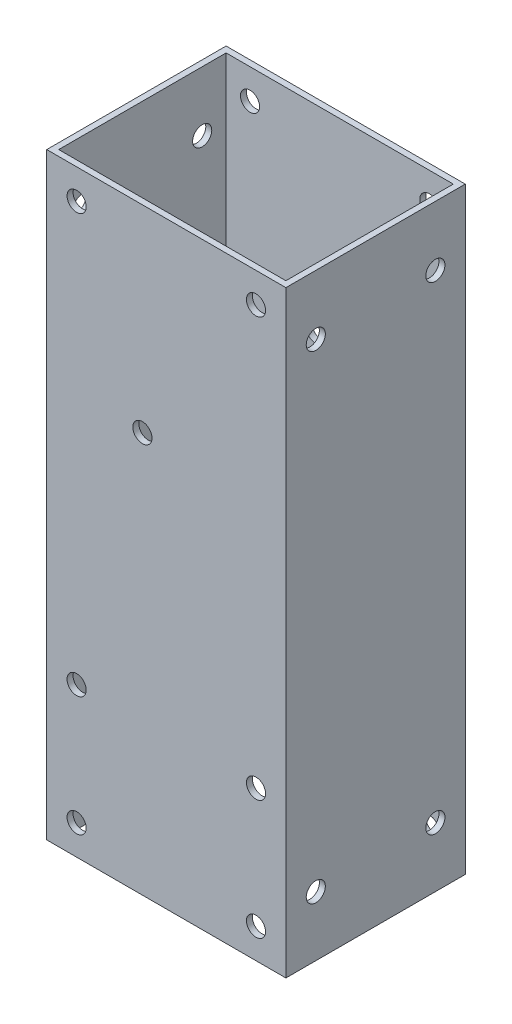
ISO-10303-21;
HEADER;
FILE_DESCRIPTION(('STEP AP214'),'2;1');
FILE_NAME('part.step','',(''),(''),'','','');
FILE_SCHEMA(('AUTOMOTIVE_DESIGN { 1 0 10303 214 1 1 1 1 }'));
ENDSEC;
DATA;
#1=APPLICATION_CONTEXT('core data for automotive mechanical design processes');
#2=APPLICATION_PROTOCOL_DEFINITION('international standard','automotive_design',2000,#1);
#3=PRODUCT_CONTEXT('',#1,'mechanical');
#4=PRODUCT('Part','Part','',(#3));
#5=PRODUCT_RELATED_PRODUCT_CATEGORY('part','',(#4));
#6=PRODUCT_DEFINITION_FORMATION('','',#4);
#7=PRODUCT_DEFINITION_CONTEXT('part definition',#1,'design');
#8=PRODUCT_DEFINITION('design','',#6,#7);
#9=PRODUCT_DEFINITION_SHAPE('','',#8);
#10=(LENGTH_UNIT() NAMED_UNIT(*) SI_UNIT(.MILLI.,.METRE.));
#11=(NAMED_UNIT(*) PLANE_ANGLE_UNIT() SI_UNIT($,.RADIAN.));
#12=(NAMED_UNIT(*) SI_UNIT($,.STERADIAN.) SOLID_ANGLE_UNIT());
#13=UNCERTAINTY_MEASURE_WITH_UNIT(LENGTH_MEASURE(1.E-05),#10,'distance_accuracy_value','');
#14=(GEOMETRIC_REPRESENTATION_CONTEXT(3) GLOBAL_UNCERTAINTY_ASSIGNED_CONTEXT((#13)) GLOBAL_UNIT_ASSIGNED_CONTEXT((#10,
#11,#12)) REPRESENTATION_CONTEXT('',''));
#15=CARTESIAN_POINT('',(0.,0.,0.));
#16=DIRECTION('',(0.,0.,1.));
#17=DIRECTION('',(1.,0.,0.));
#18=AXIS2_PLACEMENT_3D('',#15,#16,#17);
#19=CARTESIAN_POINT('',(0.,100.,0.));
#20=DIRECTION('',(0.,1.,0.));
#21=DIRECTION('',(0.,0.,1.));
#22=AXIS2_PLACEMENT_3D('',#19,#20,#21);
#23=PLANE('',#22);
#24=DIRECTION('',(0.,0.,1.));
#25=VECTOR('',#24,1.);
#26=CARTESIAN_POINT('',(0.,100.,0.));
#27=LINE('',#26,#25);
#28=CARTESIAN_POINT('',(0.,100.,-30.));
#29=VERTEX_POINT('',#28);
#30=CARTESIAN_POINT('',(0.,100.,0.));
#31=VERTEX_POINT('',#30);
#32=EDGE_CURVE('E174',#29,#31,#27,.T.);
#33=ORIENTED_EDGE('',*,*,#32,.T.);
#34=DIRECTION('',(1.,0.,0.));
#35=VECTOR('',#34,1.);
#36=CARTESIAN_POINT('',(0.,100.,0.));
#37=LINE('',#36,#35);
#38=CARTESIAN_POINT('',(40.,100.,0.));
#39=VERTEX_POINT('',#38);
#40=EDGE_CURVE('E177',#31,#39,#37,.T.);
#41=ORIENTED_EDGE('',*,*,#40,.T.);
#42=DIRECTION('',(0.,0.,-1.));
#43=VECTOR('',#42,1.);
#44=CARTESIAN_POINT('',(40.,100.,0.));
#45=LINE('',#44,#43);
#46=CARTESIAN_POINT('',(40.,100.,-30.));
#47=VERTEX_POINT('',#46);
#48=EDGE_CURVE('E180',#39,#47,#45,.T.);
#49=ORIENTED_EDGE('',*,*,#48,.T.);
#50=DIRECTION('',(-1.,0.,0.));
#51=VECTOR('',#50,1.);
#52=CARTESIAN_POINT('',(0.,100.,-30.));
#53=LINE('',#52,#51);
#54=EDGE_CURVE('E182',#47,#29,#53,.T.);
#55=ORIENTED_EDGE('',*,*,#54,.T.);
#56=EDGE_LOOP('',(#33,#41,#49,#55));
#57=FACE_BOUND('',#56,.T.);
#58=DIRECTION('',(1.,0.,0.));
#59=VECTOR('',#58,1.);
#60=CARTESIAN_POINT('',(0.,100.,-1.));
#61=LINE('',#60,#59);
#62=CARTESIAN_POINT('',(1.,100.,-1.));
#63=VERTEX_POINT('',#62);
#64=CARTESIAN_POINT('',(39.,100.,-1.));
#65=VERTEX_POINT('',#64);
#66=EDGE_CURVE('E144',#63,#65,#61,.T.);
#67=ORIENTED_EDGE('',*,*,#66,.F.);
#68=DIRECTION('',(0.,0.,1.));
#69=VECTOR('',#68,1.);
#70=CARTESIAN_POINT('',(1.,100.,0.));
#71=LINE('',#70,#69);
#72=CARTESIAN_POINT('',(1.,100.,-29.));
#73=VERTEX_POINT('',#72);
#74=EDGE_CURVE('E136',#73,#63,#71,.T.);
#75=ORIENTED_EDGE('',*,*,#74,.F.);
#76=DIRECTION('',(-1.,0.,0.));
#77=VECTOR('',#76,1.);
#78=CARTESIAN_POINT('',(0.,100.,-29.));
#79=LINE('',#78,#77);
#80=CARTESIAN_POINT('',(39.,100.,-29.));
#81=VERTEX_POINT('',#80);
#82=EDGE_CURVE('E158',#81,#73,#79,.T.);
#83=ORIENTED_EDGE('',*,*,#82,.F.);
#84=DIRECTION('',(0.,0.,-1.));
#85=VECTOR('',#84,1.);
#86=CARTESIAN_POINT('',(39.,100.,0.));
#87=LINE('',#86,#85);
#88=EDGE_CURVE('E156',#65,#81,#87,.T.);
#89=ORIENTED_EDGE('',*,*,#88,.F.);
#90=EDGE_LOOP('',(#67,#75,#83,#89));
#91=FACE_BOUND('',#90,.T.);
#92=ADVANCED_FACE('F69',(#57,#91),#23,.T.);
#93=CARTESIAN_POINT('',(0.,0.,0.));
#94=DIRECTION('',(0.,1.,0.));
#95=DIRECTION('',(0.,0.,1.));
#96=AXIS2_PLACEMENT_3D('',#93,#94,#95);
#97=PLANE('',#96);
#98=DIRECTION('',(0.,0.,1.));
#99=VECTOR('',#98,1.);
#100=CARTESIAN_POINT('',(0.,0.,0.));
#101=LINE('',#100,#99);
#102=CARTESIAN_POINT('',(0.,0.,-30.));
#103=VERTEX_POINT('',#102);
#104=CARTESIAN_POINT('',(0.,0.,0.));
#105=VERTEX_POINT('',#104);
#106=EDGE_CURVE('E152',#103,#105,#101,.T.);
#107=ORIENTED_EDGE('',*,*,#106,.F.);
#108=DIRECTION('',(-1.,0.,0.));
#109=VECTOR('',#108,1.);
#110=CARTESIAN_POINT('',(0.,0.,-30.));
#111=LINE('',#110,#109);
#112=CARTESIAN_POINT('',(40.,0.,-30.));
#113=VERTEX_POINT('',#112);
#114=EDGE_CURVE('E178',#113,#103,#111,.T.);
#115=ORIENTED_EDGE('',*,*,#114,.F.);
#116=DIRECTION('',(0.,0.,-1.));
#117=VECTOR('',#116,1.);
#118=CARTESIAN_POINT('',(40.,0.,0.));
#119=LINE('',#118,#117);
#120=CARTESIAN_POINT('',(40.,0.,0.));
#121=VERTEX_POINT('',#120);
#122=EDGE_CURVE('E189',#121,#113,#119,.T.);
#123=ORIENTED_EDGE('',*,*,#122,.F.);
#124=DIRECTION('',(1.,0.,0.));
#125=VECTOR('',#124,1.);
#126=CARTESIAN_POINT('',(0.,0.,0.));
#127=LINE('',#126,#125);
#128=EDGE_CURVE('E187',#105,#121,#127,.T.);
#129=ORIENTED_EDGE('',*,*,#128,.F.);
#130=EDGE_LOOP('',(#107,#115,#123,#129));
#131=FACE_BOUND('',#130,.T.);
#132=DIRECTION('',(0.,0.,1.));
#133=VECTOR('',#132,1.);
#134=CARTESIAN_POINT('',(1.,0.,0.));
#135=LINE('',#134,#133);
#136=CARTESIAN_POINT('',(1.,0.,-29.));
#137=VERTEX_POINT('',#136);
#138=CARTESIAN_POINT('',(1.,0.,-1.));
#139=VERTEX_POINT('',#138);
#140=EDGE_CURVE('E94',#137,#139,#135,.T.);
#141=ORIENTED_EDGE('',*,*,#140,.T.);
#142=DIRECTION('',(1.,0.,0.));
#143=VECTOR('',#142,1.);
#144=CARTESIAN_POINT('',(0.,0.,-1.));
#145=LINE('',#144,#143);
#146=CARTESIAN_POINT('',(39.,0.,-1.));
#147=VERTEX_POINT('',#146);
#148=EDGE_CURVE('E151',#139,#147,#145,.T.);
#149=ORIENTED_EDGE('',*,*,#148,.T.);
#150=DIRECTION('',(0.,0.,-1.));
#151=VECTOR('',#150,1.);
#152=CARTESIAN_POINT('',(39.,0.,0.));
#153=LINE('',#152,#151);
#154=CARTESIAN_POINT('',(39.,0.,-29.));
#155=VERTEX_POINT('',#154);
#156=EDGE_CURVE('E166',#147,#155,#153,.T.);
#157=ORIENTED_EDGE('',*,*,#156,.T.);
#158=DIRECTION('',(-1.,0.,0.));
#159=VECTOR('',#158,1.);
#160=CARTESIAN_POINT('',(0.,0.,-29.));
#161=LINE('',#160,#159);
#162=EDGE_CURVE('E145',#155,#137,#161,.T.);
#163=ORIENTED_EDGE('',*,*,#162,.T.);
#164=EDGE_LOOP('',(#141,#149,#157,#163));
#165=FACE_BOUND('',#164,.T.);
#166=ADVANCED_FACE('F337',(#131,#165),#97,.F.);
#167=CARTESIAN_POINT('',(0.,100.,0.));
#168=DIRECTION('',(1.,0.,0.));
#169=DIRECTION('',(0.,0.,-1.));
#170=AXIS2_PLACEMENT_3D('',#167,#168,#169);
#171=PLANE('',#170);
#172=CARTESIAN_POINT('',(0.,90.,-5.));
#173=DIRECTION('',(-1.,0.,0.));
#174=DIRECTION('',(0.,0.,1.));
#175=AXIS2_PLACEMENT_3D('',#172,#173,#174);
#176=CIRCLE('',#175,1.6);
#177=CARTESIAN_POINT('',(0.,90.,-3.4));
#178=VERTEX_POINT('',#177);
#179=EDGE_CURVE('E418',#178,#178,#176,.T.);
#180=ORIENTED_EDGE('',*,*,#179,.F.);
#181=EDGE_LOOP('',(#180));
#182=FACE_BOUND('',#181,.T.);
#183=CARTESIAN_POINT('',(0.,10.,-25.));
#184=DIRECTION('',(-1.,0.,0.));
#185=DIRECTION('',(0.,0.,1.));
#186=AXIS2_PLACEMENT_3D('',#183,#184,#185);
#187=CIRCLE('',#186,1.6);
#188=CARTESIAN_POINT('',(0.,10.,-23.4));
#189=VERTEX_POINT('',#188);
#190=EDGE_CURVE('E383',#189,#189,#187,.T.);
#191=ORIENTED_EDGE('',*,*,#190,.F.);
#192=EDGE_LOOP('',(#191));
#193=FACE_BOUND('',#192,.T.);
#194=CARTESIAN_POINT('',(0.,10.,-4.99999999999999));
#195=DIRECTION('',(-1.,0.,0.));
#196=DIRECTION('',(0.,0.,1.));
#197=AXIS2_PLACEMENT_3D('',#194,#195,#196);
#198=CIRCLE('',#197,1.6);
#199=CARTESIAN_POINT('',(0.,10.,-3.39999999999999));
#200=VERTEX_POINT('',#199);
#201=EDGE_CURVE('E409',#200,#200,#198,.T.);
#202=ORIENTED_EDGE('',*,*,#201,.F.);
#203=EDGE_LOOP('',(#202));
#204=FACE_BOUND('',#203,.T.);
#205=CARTESIAN_POINT('',(0.,90.,-25.));
#206=DIRECTION('',(-1.,0.,0.));
#207=DIRECTION('',(0.,0.,1.));
#208=AXIS2_PLACEMENT_3D('',#205,#206,#207);
#209=CIRCLE('',#208,1.6);
#210=CARTESIAN_POINT('',(0.,90.,-23.4));
#211=VERTEX_POINT('',#210);
#212=EDGE_CURVE('E378',#211,#211,#209,.T.);
#213=ORIENTED_EDGE('',*,*,#212,.F.);
#214=EDGE_LOOP('',(#213));
#215=FACE_BOUND('',#214,.T.);
#216=ORIENTED_EDGE('',*,*,#106,.T.);
#217=DIRECTION('',(0.,-1.,0.));
#218=VECTOR('',#217,1.);
#219=CARTESIAN_POINT('',(0.,100.,0.));
#220=LINE('',#219,#218);
#221=EDGE_CURVE('E12',#31,#105,#220,.T.);
#222=ORIENTED_EDGE('',*,*,#221,.F.);
#223=ORIENTED_EDGE('',*,*,#32,.F.);
#224=DIRECTION('',(0.,-1.,0.));
#225=VECTOR('',#224,1.);
#226=CARTESIAN_POINT('',(0.,100.,-30.));
#227=LINE('',#226,#225);
#228=EDGE_CURVE('E184',#29,#103,#227,.T.);
#229=ORIENTED_EDGE('',*,*,#228,.T.);
#230=EDGE_LOOP('',(#216,#222,#223,#229));
#231=FACE_BOUND('',#230,.T.);
#232=ADVANCED_FACE('F71',(#182,#193,#204,#215,#231),#171,.F.);
#233=CARTESIAN_POINT('',(0.,100.,0.));
#234=DIRECTION('',(0.,0.,-1.));
#235=DIRECTION('',(-1.,0.,0.));
#236=AXIS2_PLACEMENT_3D('',#233,#234,#235);
#237=PLANE('',#236);
#238=CARTESIAN_POINT('',(16.,67.,0.));
#239=DIRECTION('',(0.,0.,1.));
#240=DIRECTION('',(1.,0.,0.));
#241=AXIS2_PLACEMENT_3D('',#238,#239,#240);
#242=CIRCLE('',#241,1.60000000000001);
#243=CARTESIAN_POINT('',(17.6,67.,0.));
#244=VERTEX_POINT('',#243);
#245=EDGE_CURVE('E630',#244,#244,#242,.T.);
#246=ORIENTED_EDGE('',*,*,#245,.F.);
#247=EDGE_LOOP('',(#246));
#248=FACE_BOUND('',#247,.T.);
#249=CARTESIAN_POINT('',(35.,95.,0.));
#250=DIRECTION('',(0.,0.,1.));
#251=DIRECTION('',(1.,0.,0.));
#252=AXIS2_PLACEMENT_3D('',#249,#250,#251);
#253=CIRCLE('',#252,1.6);
#254=CARTESIAN_POINT('',(36.6,95.,0.));
#255=VERTEX_POINT('',#254);
#256=EDGE_CURVE('E260',#255,#255,#253,.T.);
#257=ORIENTED_EDGE('',*,*,#256,.F.);
#258=EDGE_LOOP('',(#257));
#259=FACE_BOUND('',#258,.T.);
#260=CARTESIAN_POINT('',(35.,25.,0.));
#261=DIRECTION('',(0.,0.,1.));
#262=DIRECTION('',(1.,0.,0.));
#263=AXIS2_PLACEMENT_3D('',#260,#261,#262);
#264=CIRCLE('',#263,1.6);
#265=CARTESIAN_POINT('',(36.6,25.,0.));
#266=VERTEX_POINT('',#265);
#267=EDGE_CURVE('E266',#266,#266,#264,.T.);
#268=ORIENTED_EDGE('',*,*,#267,.F.);
#269=EDGE_LOOP('',(#268));
#270=FACE_BOUND('',#269,.T.);
#271=CARTESIAN_POINT('',(5.00000000000001,25.,0.));
#272=DIRECTION('',(0.,0.,1.));
#273=DIRECTION('',(1.,0.,0.));
#274=AXIS2_PLACEMENT_3D('',#271,#272,#273);
#275=CIRCLE('',#274,1.6);
#276=CARTESIAN_POINT('',(6.60000000000001,25.,0.));
#277=VERTEX_POINT('',#276);
#278=EDGE_CURVE('E272',#277,#277,#275,.T.);
#279=ORIENTED_EDGE('',*,*,#278,.F.);
#280=EDGE_LOOP('',(#279));
#281=FACE_BOUND('',#280,.T.);
#282=CARTESIAN_POINT('',(5.00000000000001,5.,0.));
#283=DIRECTION('',(0.,0.,1.));
#284=DIRECTION('',(1.,0.,0.));
#285=AXIS2_PLACEMENT_3D('',#282,#283,#284);
#286=CIRCLE('',#285,1.6);
#287=CARTESIAN_POINT('',(6.60000000000001,5.,0.));
#288=VERTEX_POINT('',#287);
#289=EDGE_CURVE('E253',#288,#288,#286,.T.);
#290=ORIENTED_EDGE('',*,*,#289,.F.);
#291=EDGE_LOOP('',(#290));
#292=FACE_BOUND('',#291,.T.);
#293=CARTESIAN_POINT('',(35.,5.,0.));
#294=DIRECTION('',(0.,0.,1.));
#295=DIRECTION('',(1.,0.,0.));
#296=AXIS2_PLACEMENT_3D('',#293,#294,#295);
#297=CIRCLE('',#296,1.6);
#298=CARTESIAN_POINT('',(36.6,5.,0.));
#299=VERTEX_POINT('',#298);
#300=EDGE_CURVE('E241',#299,#299,#297,.T.);
#301=ORIENTED_EDGE('',*,*,#300,.F.);
#302=EDGE_LOOP('',(#301));
#303=FACE_BOUND('',#302,.T.);
#304=CARTESIAN_POINT('',(5.,95.,0.));
#305=DIRECTION('',(0.,0.,1.));
#306=DIRECTION('',(1.,0.,0.));
#307=AXIS2_PLACEMENT_3D('',#304,#305,#306);
#308=CIRCLE('',#307,1.6);
#309=CARTESIAN_POINT('',(6.6,95.,0.));
#310=VERTEX_POINT('',#309);
#311=EDGE_CURVE('E259',#310,#310,#308,.T.);
#312=ORIENTED_EDGE('',*,*,#311,.F.);
#313=EDGE_LOOP('',(#312));
#314=FACE_BOUND('',#313,.T.);
#315=ORIENTED_EDGE('',*,*,#128,.T.);
#316=DIRECTION('',(0.,-1.,0.));
#317=VECTOR('',#316,1.);
#318=CARTESIAN_POINT('',(40.,100.,0.));
#319=LINE('',#318,#317);
#320=EDGE_CURVE('E78',#39,#121,#319,.T.);
#321=ORIENTED_EDGE('',*,*,#320,.F.);
#322=ORIENTED_EDGE('',*,*,#40,.F.);
#323=ORIENTED_EDGE('',*,*,#221,.T.);
#324=EDGE_LOOP('',(#315,#321,#322,#323));
#325=FACE_BOUND('',#324,.T.);
#326=ADVANCED_FACE('F323',(#248,#259,#270,#281,#292,#303,#314,#325),#237,.F.);
#327=CARTESIAN_POINT('',(40.,100.,0.));
#328=DIRECTION('',(-1.,0.,0.));
#329=DIRECTION('',(0.,0.,1.));
#330=AXIS2_PLACEMENT_3D('',#327,#328,#329);
#331=PLANE('',#330);
#332=CARTESIAN_POINT('',(40.,90.,-5.));
#333=DIRECTION('',(-1.,0.,0.));
#334=DIRECTION('',(0.,0.,1.));
#335=AXIS2_PLACEMENT_3D('',#332,#333,#334);
#336=CIRCLE('',#335,1.6);
#337=CARTESIAN_POINT('',(40.,90.,-3.4));
#338=VERTEX_POINT('',#337);
#339=EDGE_CURVE('E366',#338,#338,#336,.T.);
#340=ORIENTED_EDGE('',*,*,#339,.T.);
#341=EDGE_LOOP('',(#340));
#342=FACE_BOUND('',#341,.T.);
#343=CARTESIAN_POINT('',(40.,10.,-25.));
#344=DIRECTION('',(-1.,0.,0.));
#345=DIRECTION('',(0.,0.,1.));
#346=AXIS2_PLACEMENT_3D('',#343,#344,#345);
#347=CIRCLE('',#346,1.6);
#348=CARTESIAN_POINT('',(40.,10.,-23.4));
#349=VERTEX_POINT('',#348);
#350=EDGE_CURVE('E370',#349,#349,#347,.T.);
#351=ORIENTED_EDGE('',*,*,#350,.T.);
#352=EDGE_LOOP('',(#351));
#353=FACE_BOUND('',#352,.T.);
#354=CARTESIAN_POINT('',(40.,10.,-4.99999999999999));
#355=DIRECTION('',(-1.,0.,0.));
#356=DIRECTION('',(0.,0.,1.));
#357=AXIS2_PLACEMENT_3D('',#354,#355,#356);
#358=CIRCLE('',#357,1.6);
#359=CARTESIAN_POINT('',(40.,10.,-3.39999999999999));
#360=VERTEX_POINT('',#359);
#361=EDGE_CURVE('E374',#360,#360,#358,.T.);
#362=ORIENTED_EDGE('',*,*,#361,.T.);
#363=EDGE_LOOP('',(#362));
#364=FACE_BOUND('',#363,.T.);
#365=CARTESIAN_POINT('',(40.,90.,-25.));
#366=DIRECTION('',(-1.,0.,0.));
#367=DIRECTION('',(0.,0.,1.));
#368=AXIS2_PLACEMENT_3D('',#365,#366,#367);
#369=CIRCLE('',#368,1.6);
#370=CARTESIAN_POINT('',(40.,90.,-23.4));
#371=VERTEX_POINT('',#370);
#372=EDGE_CURVE('E227',#371,#371,#369,.T.);
#373=ORIENTED_EDGE('',*,*,#372,.T.);
#374=EDGE_LOOP('',(#373));
#375=FACE_BOUND('',#374,.T.);
#376=ORIENTED_EDGE('',*,*,#122,.T.);
#377=DIRECTION('',(0.,-1.,0.));
#378=VECTOR('',#377,1.);
#379=CARTESIAN_POINT('',(40.,100.,-30.));
#380=LINE('',#379,#378);
#381=EDGE_CURVE('E194',#47,#113,#380,.T.);
#382=ORIENTED_EDGE('',*,*,#381,.F.);
#383=ORIENTED_EDGE('',*,*,#48,.F.);
#384=ORIENTED_EDGE('',*,*,#320,.T.);
#385=EDGE_LOOP('',(#376,#382,#383,#384));
#386=FACE_BOUND('',#385,.T.);
#387=ADVANCED_FACE('F326',(#342,#353,#364,#375,#386),#331,.F.);
#388=CARTESIAN_POINT('',(0.,100.,-30.));
#389=DIRECTION('',(0.,0.,1.));
#390=DIRECTION('',(1.,0.,0.));
#391=AXIS2_PLACEMENT_3D('',#388,#389,#390);
#392=PLANE('',#391);
#393=CARTESIAN_POINT('',(16.,67.,-30.));
#394=DIRECTION('',(0.,0.,1.));
#395=DIRECTION('',(1.,0.,0.));
#396=AXIS2_PLACEMENT_3D('',#393,#394,#395);
#397=CIRCLE('',#396,1.60000000000001);
#398=CARTESIAN_POINT('',(17.6,67.,-30.));
#399=VERTEX_POINT('',#398);
#400=EDGE_CURVE('E629',#399,#399,#397,.T.);
#401=ORIENTED_EDGE('',*,*,#400,.T.);
#402=EDGE_LOOP('',(#401));
#403=FACE_BOUND('',#402,.T.);
#404=CARTESIAN_POINT('',(35.,95.,-30.));
#405=DIRECTION('',(0.,0.,1.));
#406=DIRECTION('',(1.,0.,0.));
#407=AXIS2_PLACEMENT_3D('',#404,#405,#406);
#408=CIRCLE('',#407,1.6);
#409=CARTESIAN_POINT('',(36.6,95.,-30.));
#410=VERTEX_POINT('',#409);
#411=EDGE_CURVE('E256',#410,#410,#408,.T.);
#412=ORIENTED_EDGE('',*,*,#411,.T.);
#413=EDGE_LOOP('',(#412));
#414=FACE_BOUND('',#413,.T.);
#415=CARTESIAN_POINT('',(35.,25.,-30.));
#416=DIRECTION('',(0.,0.,1.));
#417=DIRECTION('',(1.,0.,0.));
#418=AXIS2_PLACEMENT_3D('',#415,#416,#417);
#419=CIRCLE('',#418,1.6);
#420=CARTESIAN_POINT('',(36.6,25.,-30.));
#421=VERTEX_POINT('',#420);
#422=EDGE_CURVE('E263',#421,#421,#419,.T.);
#423=ORIENTED_EDGE('',*,*,#422,.T.);
#424=EDGE_LOOP('',(#423));
#425=FACE_BOUND('',#424,.T.);
#426=CARTESIAN_POINT('',(5.00000000000001,25.,-30.));
#427=DIRECTION('',(0.,0.,1.));
#428=DIRECTION('',(1.,0.,0.));
#429=AXIS2_PLACEMENT_3D('',#426,#427,#428);
#430=CIRCLE('',#429,1.6);
#431=CARTESIAN_POINT('',(6.60000000000001,25.,-30.));
#432=VERTEX_POINT('',#431);
#433=EDGE_CURVE('E269',#432,#432,#430,.T.);
#434=ORIENTED_EDGE('',*,*,#433,.T.);
#435=EDGE_LOOP('',(#434));
#436=FACE_BOUND('',#435,.T.);
#437=CARTESIAN_POINT('',(5.00000000000001,5.,-30.));
#438=DIRECTION('',(0.,0.,1.));
#439=DIRECTION('',(1.,0.,0.));
#440=AXIS2_PLACEMENT_3D('',#437,#438,#439);
#441=CIRCLE('',#440,1.6);
#442=CARTESIAN_POINT('',(6.60000000000001,5.,-30.));
#443=VERTEX_POINT('',#442);
#444=EDGE_CURVE('E275',#443,#443,#441,.T.);
#445=ORIENTED_EDGE('',*,*,#444,.T.);
#446=EDGE_LOOP('',(#445));
#447=FACE_BOUND('',#446,.T.);
#448=CARTESIAN_POINT('',(35.,5.,-30.));
#449=DIRECTION('',(0.,0.,1.));
#450=DIRECTION('',(1.,0.,0.));
#451=AXIS2_PLACEMENT_3D('',#448,#449,#450);
#452=CIRCLE('',#451,1.6);
#453=CARTESIAN_POINT('',(36.6,5.,-30.));
#454=VERTEX_POINT('',#453);
#455=EDGE_CURVE('E250',#454,#454,#452,.T.);
#456=ORIENTED_EDGE('',*,*,#455,.T.);
#457=EDGE_LOOP('',(#456));
#458=FACE_BOUND('',#457,.T.);
#459=CARTESIAN_POINT('',(5.,95.,-30.));
#460=DIRECTION('',(0.,0.,1.));
#461=DIRECTION('',(1.,0.,0.));
#462=AXIS2_PLACEMENT_3D('',#459,#460,#461);
#463=CIRCLE('',#462,1.6);
#464=CARTESIAN_POINT('',(6.6,95.,-30.));
#465=VERTEX_POINT('',#464);
#466=EDGE_CURVE('E203',#465,#465,#463,.T.);
#467=ORIENTED_EDGE('',*,*,#466,.T.);
#468=EDGE_LOOP('',(#467));
#469=FACE_BOUND('',#468,.T.);
#470=ORIENTED_EDGE('',*,*,#114,.T.);
#471=ORIENTED_EDGE('',*,*,#228,.F.);
#472=ORIENTED_EDGE('',*,*,#54,.F.);
#473=ORIENTED_EDGE('',*,*,#381,.T.);
#474=EDGE_LOOP('',(#470,#471,#472,#473));
#475=FACE_BOUND('',#474,.T.);
#476=ADVANCED_FACE('F341',(#403,#414,#425,#436,#447,#458,#469,#475),#392,.F.);
#477=CARTESIAN_POINT('',(1.,100.,0.));
#478=DIRECTION('',(1.,0.,0.));
#479=DIRECTION('',(0.,0.,-1.));
#480=AXIS2_PLACEMENT_3D('',#477,#478,#479);
#481=PLANE('',#480);
#482=CARTESIAN_POINT('',(1.,90.,-5.));
#483=DIRECTION('',(1.,0.,0.));
#484=DIRECTION('',(0.,0.,-1.));
#485=AXIS2_PLACEMENT_3D('',#482,#483,#484);
#486=CIRCLE('',#485,1.6);
#487=CARTESIAN_POINT('',(1.,90.,-6.6));
#488=VERTEX_POINT('',#487);
#489=EDGE_CURVE('E237',#488,#488,#486,.T.);
#490=ORIENTED_EDGE('',*,*,#489,.F.);
#491=EDGE_LOOP('',(#490));
#492=FACE_BOUND('',#491,.T.);
#493=CARTESIAN_POINT('',(1.,10.,-25.));
#494=DIRECTION('',(1.,0.,0.));
#495=DIRECTION('',(0.,0.,-1.));
#496=AXIS2_PLACEMENT_3D('',#493,#494,#495);
#497=CIRCLE('',#496,1.6);
#498=CARTESIAN_POINT('',(1.,10.,-26.6));
#499=VERTEX_POINT('',#498);
#500=EDGE_CURVE('E234',#499,#499,#497,.T.);
#501=ORIENTED_EDGE('',*,*,#500,.F.);
#502=EDGE_LOOP('',(#501));
#503=FACE_BOUND('',#502,.T.);
#504=CARTESIAN_POINT('',(1.,10.,-4.99999999999999));
#505=DIRECTION('',(1.,0.,0.));
#506=DIRECTION('',(0.,0.,-1.));
#507=AXIS2_PLACEMENT_3D('',#504,#505,#506);
#508=CIRCLE('',#507,1.6);
#509=CARTESIAN_POINT('',(1.,10.,-6.59999999999999));
#510=VERTEX_POINT('',#509);
#511=EDGE_CURVE('E231',#510,#510,#508,.T.);
#512=ORIENTED_EDGE('',*,*,#511,.F.);
#513=EDGE_LOOP('',(#512));
#514=FACE_BOUND('',#513,.T.);
#515=CARTESIAN_POINT('',(1.,90.,-25.));
#516=DIRECTION('',(1.,0.,0.));
#517=DIRECTION('',(0.,0.,-1.));
#518=AXIS2_PLACEMENT_3D('',#515,#516,#517);
#519=CIRCLE('',#518,1.6);
#520=CARTESIAN_POINT('',(1.,90.,-26.6));
#521=VERTEX_POINT('',#520);
#522=EDGE_CURVE('E226',#521,#521,#519,.T.);
#523=ORIENTED_EDGE('',*,*,#522,.F.);
#524=EDGE_LOOP('',(#523));
#525=FACE_BOUND('',#524,.T.);
#526=ORIENTED_EDGE('',*,*,#140,.F.);
#527=DIRECTION('',(0.,-1.,0.));
#528=VECTOR('',#527,1.);
#529=CARTESIAN_POINT('',(1.,100.,-29.));
#530=LINE('',#529,#528);
#531=EDGE_CURVE('E140',#73,#137,#530,.T.);
#532=ORIENTED_EDGE('',*,*,#531,.F.);
#533=ORIENTED_EDGE('',*,*,#74,.T.);
#534=DIRECTION('',(0.,-1.,0.));
#535=VECTOR('',#534,1.);
#536=CARTESIAN_POINT('',(1.,100.,-1.));
#537=LINE('',#536,#535);
#538=EDGE_CURVE('E139',#63,#139,#537,.T.);
#539=ORIENTED_EDGE('',*,*,#538,.T.);
#540=EDGE_LOOP('',(#526,#532,#533,#539));
#541=FACE_BOUND('',#540,.T.);
#542=ADVANCED_FACE('F138',(#492,#503,#514,#525,#541),#481,.T.);
#543=CARTESIAN_POINT('',(0.,100.,-1.));
#544=DIRECTION('',(0.,0.,-1.));
#545=DIRECTION('',(-1.,0.,0.));
#546=AXIS2_PLACEMENT_3D('',#543,#544,#545);
#547=PLANE('',#546);
#548=CARTESIAN_POINT('',(16.,67.,-1.));
#549=DIRECTION('',(0.,0.,-1.));
#550=DIRECTION('',(-1.,0.,0.));
#551=AXIS2_PLACEMENT_3D('',#548,#549,#550);
#552=CIRCLE('',#551,1.60000000000001);
#553=CARTESIAN_POINT('',(14.4,67.,-1.));
#554=VERTEX_POINT('',#553);
#555=EDGE_CURVE('E411',#554,#554,#552,.T.);
#556=ORIENTED_EDGE('',*,*,#555,.F.);
#557=EDGE_LOOP('',(#556));
#558=FACE_BOUND('',#557,.T.);
#559=CARTESIAN_POINT('',(35.,95.,-1.));
#560=DIRECTION('',(0.,0.,-1.));
#561=DIRECTION('',(-1.,0.,0.));
#562=AXIS2_PLACEMENT_3D('',#559,#560,#561);
#563=CIRCLE('',#562,1.6);
#564=CARTESIAN_POINT('',(33.4,95.,-1.));
#565=VERTEX_POINT('',#564);
#566=EDGE_CURVE('E164',#565,#565,#563,.T.);
#567=ORIENTED_EDGE('',*,*,#566,.F.);
#568=EDGE_LOOP('',(#567));
#569=FACE_BOUND('',#568,.T.);
#570=CARTESIAN_POINT('',(35.,25.,-1.));
#571=DIRECTION('',(0.,0.,-1.));
#572=DIRECTION('',(-1.,0.,0.));
#573=AXIS2_PLACEMENT_3D('',#570,#571,#572);
#574=CIRCLE('',#573,1.6);
#575=CARTESIAN_POINT('',(33.4,25.,-1.));
#576=VERTEX_POINT('',#575);
#577=EDGE_CURVE('E219',#576,#576,#574,.T.);
#578=ORIENTED_EDGE('',*,*,#577,.F.);
#579=EDGE_LOOP('',(#578));
#580=FACE_BOUND('',#579,.T.);
#581=CARTESIAN_POINT('',(5.00000000000001,25.,-1.));
#582=DIRECTION('',(0.,0.,-1.));
#583=DIRECTION('',(-1.,0.,0.));
#584=AXIS2_PLACEMENT_3D('',#581,#582,#583);
#585=CIRCLE('',#584,1.6);
#586=CARTESIAN_POINT('',(3.40000000000001,25.,-1.));
#587=VERTEX_POINT('',#586);
#588=EDGE_CURVE('E215',#587,#587,#585,.T.);
#589=ORIENTED_EDGE('',*,*,#588,.F.);
#590=EDGE_LOOP('',(#589));
#591=FACE_BOUND('',#590,.T.);
#592=CARTESIAN_POINT('',(5.00000000000001,5.,-1.));
#593=DIRECTION('',(0.,0.,-1.));
#594=DIRECTION('',(-1.,0.,0.));
#595=AXIS2_PLACEMENT_3D('',#592,#593,#594);
#596=CIRCLE('',#595,1.6);
#597=CARTESIAN_POINT('',(3.40000000000001,5.,-1.));
#598=VERTEX_POINT('',#597);
#599=EDGE_CURVE('E211',#598,#598,#596,.T.);
#600=ORIENTED_EDGE('',*,*,#599,.F.);
#601=EDGE_LOOP('',(#600));
#602=FACE_BOUND('',#601,.T.);
#603=CARTESIAN_POINT('',(35.,5.,-1.));
#604=DIRECTION('',(0.,0.,-1.));
#605=DIRECTION('',(-1.,0.,0.));
#606=AXIS2_PLACEMENT_3D('',#603,#604,#605);
#607=CIRCLE('',#606,1.6);
#608=CARTESIAN_POINT('',(33.4,5.,-1.));
#609=VERTEX_POINT('',#608);
#610=EDGE_CURVE('E207',#609,#609,#607,.T.);
#611=ORIENTED_EDGE('',*,*,#610,.F.);
#612=EDGE_LOOP('',(#611));
#613=FACE_BOUND('',#612,.T.);
#614=CARTESIAN_POINT('',(5.,95.,-1.));
#615=DIRECTION('',(0.,0.,-1.));
#616=DIRECTION('',(-1.,0.,0.));
#617=AXIS2_PLACEMENT_3D('',#614,#615,#616);
#618=CIRCLE('',#617,1.6);
#619=CARTESIAN_POINT('',(3.4,95.,-1.));
#620=VERTEX_POINT('',#619);
#621=EDGE_CURVE('E202',#620,#620,#618,.T.);
#622=ORIENTED_EDGE('',*,*,#621,.F.);
#623=EDGE_LOOP('',(#622));
#624=FACE_BOUND('',#623,.T.);
#625=ORIENTED_EDGE('',*,*,#148,.F.);
#626=ORIENTED_EDGE('',*,*,#538,.F.);
#627=ORIENTED_EDGE('',*,*,#66,.T.);
#628=DIRECTION('',(0.,-1.,0.));
#629=VECTOR('',#628,1.);
#630=CARTESIAN_POINT('',(39.,100.,-1.));
#631=LINE('',#630,#629);
#632=EDGE_CURVE('E153',#65,#147,#631,.T.);
#633=ORIENTED_EDGE('',*,*,#632,.T.);
#634=EDGE_LOOP('',(#625,#626,#627,#633));
#635=FACE_BOUND('',#634,.T.);
#636=ADVANCED_FACE('F148',(#558,#569,#580,#591,#602,#613,#624,#635),#547,.T.);
#637=CARTESIAN_POINT('',(39.,100.,0.));
#638=DIRECTION('',(-1.,0.,0.));
#639=DIRECTION('',(0.,0.,1.));
#640=AXIS2_PLACEMENT_3D('',#637,#638,#639);
#641=PLANE('',#640);
#642=CARTESIAN_POINT('',(39.,90.,-5.));
#643=DIRECTION('',(-1.,0.,0.));
#644=DIRECTION('',(0.,0.,1.));
#645=AXIS2_PLACEMENT_3D('',#642,#643,#644);
#646=CIRCLE('',#645,1.6);
#647=CARTESIAN_POINT('',(39.,90.,-3.4));
#648=VERTEX_POINT('',#647);
#649=EDGE_CURVE('E235',#648,#648,#646,.T.);
#650=ORIENTED_EDGE('',*,*,#649,.F.);
#651=EDGE_LOOP('',(#650));
#652=FACE_BOUND('',#651,.T.);
#653=CARTESIAN_POINT('',(39.,10.,-25.));
#654=DIRECTION('',(-1.,0.,0.));
#655=DIRECTION('',(0.,0.,1.));
#656=AXIS2_PLACEMENT_3D('',#653,#654,#655);
#657=CIRCLE('',#656,1.6);
#658=CARTESIAN_POINT('',(39.,10.,-23.4));
#659=VERTEX_POINT('',#658);
#660=EDGE_CURVE('E232',#659,#659,#657,.T.);
#661=ORIENTED_EDGE('',*,*,#660,.F.);
#662=EDGE_LOOP('',(#661));
#663=FACE_BOUND('',#662,.T.);
#664=CARTESIAN_POINT('',(39.,10.,-4.99999999999999));
#665=DIRECTION('',(-1.,0.,0.));
#666=DIRECTION('',(0.,0.,1.));
#667=AXIS2_PLACEMENT_3D('',#664,#665,#666);
#668=CIRCLE('',#667,1.6);
#669=CARTESIAN_POINT('',(39.,10.,-3.39999999999999));
#670=VERTEX_POINT('',#669);
#671=EDGE_CURVE('E228',#670,#670,#668,.T.);
#672=ORIENTED_EDGE('',*,*,#671,.F.);
#673=EDGE_LOOP('',(#672));
#674=FACE_BOUND('',#673,.T.);
#675=CARTESIAN_POINT('',(39.,90.,-25.));
#676=DIRECTION('',(-1.,0.,0.));
#677=DIRECTION('',(0.,0.,1.));
#678=AXIS2_PLACEMENT_3D('',#675,#676,#677);
#679=CIRCLE('',#678,1.6);
#680=CARTESIAN_POINT('',(39.,90.,-23.4));
#681=VERTEX_POINT('',#680);
#682=EDGE_CURVE('E223',#681,#681,#679,.T.);
#683=ORIENTED_EDGE('',*,*,#682,.F.);
#684=EDGE_LOOP('',(#683));
#685=FACE_BOUND('',#684,.T.);
#686=ORIENTED_EDGE('',*,*,#156,.F.);
#687=ORIENTED_EDGE('',*,*,#632,.F.);
#688=ORIENTED_EDGE('',*,*,#88,.T.);
#689=DIRECTION('',(0.,-1.,0.));
#690=VECTOR('',#689,1.);
#691=CARTESIAN_POINT('',(39.,100.,-29.));
#692=LINE('',#691,#690);
#693=EDGE_CURVE('E86',#81,#155,#692,.T.);
#694=ORIENTED_EDGE('',*,*,#693,.T.);
#695=EDGE_LOOP('',(#686,#687,#688,#694));
#696=FACE_BOUND('',#695,.T.);
#697=ADVANCED_FACE('F301',(#652,#663,#674,#685,#696),#641,.T.);
#698=CARTESIAN_POINT('',(0.,100.,-29.));
#699=DIRECTION('',(0.,0.,1.));
#700=DIRECTION('',(1.,0.,0.));
#701=AXIS2_PLACEMENT_3D('',#698,#699,#700);
#702=PLANE('',#701);
#703=CARTESIAN_POINT('',(16.,67.,-29.));
#704=DIRECTION('',(0.,0.,1.));
#705=DIRECTION('',(1.,0.,0.));
#706=AXIS2_PLACEMENT_3D('',#703,#704,#705);
#707=CIRCLE('',#706,1.60000000000001);
#708=CARTESIAN_POINT('',(17.6,67.,-29.));
#709=VERTEX_POINT('',#708);
#710=EDGE_CURVE('E73',#709,#709,#707,.T.);
#711=ORIENTED_EDGE('',*,*,#710,.F.);
#712=EDGE_LOOP('',(#711));
#713=FACE_BOUND('',#712,.T.);
#714=CARTESIAN_POINT('',(35.,95.,-29.));
#715=DIRECTION('',(0.,0.,1.));
#716=DIRECTION('',(1.,0.,0.));
#717=AXIS2_PLACEMENT_3D('',#714,#715,#716);
#718=CIRCLE('',#717,1.6);
#719=CARTESIAN_POINT('',(36.6,95.,-29.));
#720=VERTEX_POINT('',#719);
#721=EDGE_CURVE('E220',#720,#720,#718,.T.);
#722=ORIENTED_EDGE('',*,*,#721,.F.);
#723=EDGE_LOOP('',(#722));
#724=FACE_BOUND('',#723,.T.);
#725=CARTESIAN_POINT('',(35.,25.,-29.));
#726=DIRECTION('',(0.,0.,1.));
#727=DIRECTION('',(1.,0.,0.));
#728=AXIS2_PLACEMENT_3D('',#725,#726,#727);
#729=CIRCLE('',#728,1.6);
#730=CARTESIAN_POINT('',(36.6,25.,-29.));
#731=VERTEX_POINT('',#730);
#732=EDGE_CURVE('E216',#731,#731,#729,.T.);
#733=ORIENTED_EDGE('',*,*,#732,.F.);
#734=EDGE_LOOP('',(#733));
#735=FACE_BOUND('',#734,.T.);
#736=CARTESIAN_POINT('',(5.00000000000001,25.,-29.));
#737=DIRECTION('',(0.,0.,1.));
#738=DIRECTION('',(1.,0.,0.));
#739=AXIS2_PLACEMENT_3D('',#736,#737,#738);
#740=CIRCLE('',#739,1.6);
#741=CARTESIAN_POINT('',(6.60000000000001,25.,-29.));
#742=VERTEX_POINT('',#741);
#743=EDGE_CURVE('E212',#742,#742,#740,.T.);
#744=ORIENTED_EDGE('',*,*,#743,.F.);
#745=EDGE_LOOP('',(#744));
#746=FACE_BOUND('',#745,.T.);
#747=CARTESIAN_POINT('',(5.00000000000001,5.,-29.));
#748=DIRECTION('',(0.,0.,1.));
#749=DIRECTION('',(1.,0.,0.));
#750=AXIS2_PLACEMENT_3D('',#747,#748,#749);
#751=CIRCLE('',#750,1.6);
#752=CARTESIAN_POINT('',(6.60000000000001,5.,-29.));
#753=VERTEX_POINT('',#752);
#754=EDGE_CURVE('E208',#753,#753,#751,.T.);
#755=ORIENTED_EDGE('',*,*,#754,.F.);
#756=EDGE_LOOP('',(#755));
#757=FACE_BOUND('',#756,.T.);
#758=CARTESIAN_POINT('',(35.,5.,-29.));
#759=DIRECTION('',(0.,0.,1.));
#760=DIRECTION('',(1.,0.,0.));
#761=AXIS2_PLACEMENT_3D('',#758,#759,#760);
#762=CIRCLE('',#761,1.6);
#763=CARTESIAN_POINT('',(36.6,5.,-29.));
#764=VERTEX_POINT('',#763);
#765=EDGE_CURVE('E204',#764,#764,#762,.T.);
#766=ORIENTED_EDGE('',*,*,#765,.F.);
#767=EDGE_LOOP('',(#766));
#768=FACE_BOUND('',#767,.T.);
#769=CARTESIAN_POINT('',(5.,95.,-29.));
#770=DIRECTION('',(0.,0.,1.));
#771=DIRECTION('',(1.,0.,0.));
#772=AXIS2_PLACEMENT_3D('',#769,#770,#771);
#773=CIRCLE('',#772,1.6);
#774=CARTESIAN_POINT('',(6.6,95.,-29.));
#775=VERTEX_POINT('',#774);
#776=EDGE_CURVE('E199',#775,#775,#773,.T.);
#777=ORIENTED_EDGE('',*,*,#776,.F.);
#778=EDGE_LOOP('',(#777));
#779=FACE_BOUND('',#778,.T.);
#780=ORIENTED_EDGE('',*,*,#162,.F.);
#781=ORIENTED_EDGE('',*,*,#693,.F.);
#782=ORIENTED_EDGE('',*,*,#82,.T.);
#783=ORIENTED_EDGE('',*,*,#531,.T.);
#784=EDGE_LOOP('',(#780,#781,#782,#783));
#785=FACE_BOUND('',#784,.T.);
#786=ADVANCED_FACE('F451',(#713,#724,#735,#746,#757,#768,#779,#785),#702,.T.);
#787=CARTESIAN_POINT('',(5.,95.,-30.));
#788=DIRECTION('',(0.,0.,1.));
#789=DIRECTION('',(1.,0.,0.));
#790=AXIS2_PLACEMENT_3D('',#787,#788,#789);
#791=CYLINDRICAL_SURFACE('',#790,1.6);
#792=ORIENTED_EDGE('',*,*,#776,.T.);
#793=EDGE_LOOP('',(#792));
#794=FACE_BOUND('',#793,.T.);
#795=ORIENTED_EDGE('',*,*,#466,.F.);
#796=EDGE_LOOP('',(#795));
#797=FACE_BOUND('',#796,.T.);
#798=ADVANCED_FACE('F320',(#794,#797),#791,.F.);
#799=CARTESIAN_POINT('',(35.,5.,-30.));
#800=DIRECTION('',(0.,0.,1.));
#801=DIRECTION('',(1.,0.,0.));
#802=AXIS2_PLACEMENT_3D('',#799,#800,#801);
#803=CYLINDRICAL_SURFACE('',#802,1.6);
#804=ORIENTED_EDGE('',*,*,#765,.T.);
#805=EDGE_LOOP('',(#804));
#806=FACE_BOUND('',#805,.T.);
#807=ORIENTED_EDGE('',*,*,#455,.F.);
#808=EDGE_LOOP('',(#807));
#809=FACE_BOUND('',#808,.T.);
#810=ADVANCED_FACE('F462',(#806,#809),#803,.F.);
#811=CARTESIAN_POINT('',(5.00000000000001,5.,-30.));
#812=DIRECTION('',(0.,0.,1.));
#813=DIRECTION('',(1.,0.,0.));
#814=AXIS2_PLACEMENT_3D('',#811,#812,#813);
#815=CYLINDRICAL_SURFACE('',#814,1.6);
#816=ORIENTED_EDGE('',*,*,#754,.T.);
#817=EDGE_LOOP('',(#816));
#818=FACE_BOUND('',#817,.T.);
#819=ORIENTED_EDGE('',*,*,#444,.F.);
#820=EDGE_LOOP('',(#819));
#821=FACE_BOUND('',#820,.T.);
#822=ADVANCED_FACE('F467',(#818,#821),#815,.F.);
#823=CARTESIAN_POINT('',(5.00000000000001,25.,-30.));
#824=DIRECTION('',(0.,0.,1.));
#825=DIRECTION('',(1.,0.,0.));
#826=AXIS2_PLACEMENT_3D('',#823,#824,#825);
#827=CYLINDRICAL_SURFACE('',#826,1.6);
#828=ORIENTED_EDGE('',*,*,#743,.T.);
#829=EDGE_LOOP('',(#828));
#830=FACE_BOUND('',#829,.T.);
#831=ORIENTED_EDGE('',*,*,#433,.F.);
#832=EDGE_LOOP('',(#831));
#833=FACE_BOUND('',#832,.T.);
#834=ADVANCED_FACE('F470',(#830,#833),#827,.F.);
#835=CARTESIAN_POINT('',(35.,25.,-30.));
#836=DIRECTION('',(0.,0.,1.));
#837=DIRECTION('',(1.,0.,0.));
#838=AXIS2_PLACEMENT_3D('',#835,#836,#837);
#839=CYLINDRICAL_SURFACE('',#838,1.6);
#840=ORIENTED_EDGE('',*,*,#732,.T.);
#841=EDGE_LOOP('',(#840));
#842=FACE_BOUND('',#841,.T.);
#843=ORIENTED_EDGE('',*,*,#422,.F.);
#844=EDGE_LOOP('',(#843));
#845=FACE_BOUND('',#844,.T.);
#846=ADVANCED_FACE('F475',(#842,#845),#839,.F.);
#847=CARTESIAN_POINT('',(35.,95.,-30.));
#848=DIRECTION('',(0.,0.,1.));
#849=DIRECTION('',(1.,0.,0.));
#850=AXIS2_PLACEMENT_3D('',#847,#848,#849);
#851=CYLINDRICAL_SURFACE('',#850,1.6);
#852=ORIENTED_EDGE('',*,*,#721,.T.);
#853=EDGE_LOOP('',(#852));
#854=FACE_BOUND('',#853,.T.);
#855=ORIENTED_EDGE('',*,*,#411,.F.);
#856=EDGE_LOOP('',(#855));
#857=FACE_BOUND('',#856,.T.);
#858=ADVANCED_FACE('F318',(#854,#857),#851,.F.);
#859=ORIENTED_EDGE('',*,*,#621,.T.);
#860=EDGE_LOOP('',(#859));
#861=FACE_BOUND('',#860,.T.);
#862=ORIENTED_EDGE('',*,*,#311,.T.);
#863=EDGE_LOOP('',(#862));
#864=FACE_BOUND('',#863,.T.);
#865=ADVANCED_FACE('F314',(#861,#864),#791,.F.);
#866=ORIENTED_EDGE('',*,*,#610,.T.);
#867=EDGE_LOOP('',(#866));
#868=FACE_BOUND('',#867,.T.);
#869=ORIENTED_EDGE('',*,*,#300,.T.);
#870=EDGE_LOOP('',(#869));
#871=FACE_BOUND('',#870,.T.);
#872=ADVANCED_FACE('F317',(#868,#871),#803,.F.);
#873=ORIENTED_EDGE('',*,*,#599,.T.);
#874=EDGE_LOOP('',(#873));
#875=FACE_BOUND('',#874,.T.);
#876=ORIENTED_EDGE('',*,*,#289,.T.);
#877=EDGE_LOOP('',(#876));
#878=FACE_BOUND('',#877,.T.);
#879=ADVANCED_FACE('F472',(#875,#878),#815,.F.);
#880=ORIENTED_EDGE('',*,*,#588,.T.);
#881=EDGE_LOOP('',(#880));
#882=FACE_BOUND('',#881,.T.);
#883=ORIENTED_EDGE('',*,*,#278,.T.);
#884=EDGE_LOOP('',(#883));
#885=FACE_BOUND('',#884,.T.);
#886=ADVANCED_FACE('F477',(#882,#885),#827,.F.);
#887=ORIENTED_EDGE('',*,*,#577,.T.);
#888=EDGE_LOOP('',(#887));
#889=FACE_BOUND('',#888,.T.);
#890=ORIENTED_EDGE('',*,*,#267,.T.);
#891=EDGE_LOOP('',(#890));
#892=FACE_BOUND('',#891,.T.);
#893=ADVANCED_FACE('F446',(#889,#892),#839,.F.);
#894=ORIENTED_EDGE('',*,*,#566,.T.);
#895=EDGE_LOOP('',(#894));
#896=FACE_BOUND('',#895,.T.);
#897=ORIENTED_EDGE('',*,*,#256,.T.);
#898=EDGE_LOOP('',(#897));
#899=FACE_BOUND('',#898,.T.);
#900=ADVANCED_FACE('F296',(#896,#899),#851,.F.);
#901=CARTESIAN_POINT('',(40.,90.,-25.));
#902=DIRECTION('',(-1.,0.,0.));
#903=DIRECTION('',(0.,0.,1.));
#904=AXIS2_PLACEMENT_3D('',#901,#902,#903);
#905=CYLINDRICAL_SURFACE('',#904,1.6);
#906=ORIENTED_EDGE('',*,*,#682,.T.);
#907=EDGE_LOOP('',(#906));
#908=FACE_BOUND('',#907,.T.);
#909=ORIENTED_EDGE('',*,*,#372,.F.);
#910=EDGE_LOOP('',(#909));
#911=FACE_BOUND('',#910,.T.);
#912=ADVANCED_FACE('F430',(#908,#911),#905,.F.);
#913=CARTESIAN_POINT('',(40.,10.,-4.99999999999999));
#914=DIRECTION('',(-1.,0.,0.));
#915=DIRECTION('',(0.,0.,1.));
#916=AXIS2_PLACEMENT_3D('',#913,#914,#915);
#917=CYLINDRICAL_SURFACE('',#916,1.6);
#918=ORIENTED_EDGE('',*,*,#671,.T.);
#919=EDGE_LOOP('',(#918));
#920=FACE_BOUND('',#919,.T.);
#921=ORIENTED_EDGE('',*,*,#361,.F.);
#922=EDGE_LOOP('',(#921));
#923=FACE_BOUND('',#922,.T.);
#924=ADVANCED_FACE('F406',(#920,#923),#917,.F.);
#925=CARTESIAN_POINT('',(40.,10.,-25.));
#926=DIRECTION('',(-1.,0.,0.));
#927=DIRECTION('',(0.,0.,1.));
#928=AXIS2_PLACEMENT_3D('',#925,#926,#927);
#929=CYLINDRICAL_SURFACE('',#928,1.6);
#930=ORIENTED_EDGE('',*,*,#660,.T.);
#931=EDGE_LOOP('',(#930));
#932=FACE_BOUND('',#931,.T.);
#933=ORIENTED_EDGE('',*,*,#350,.F.);
#934=EDGE_LOOP('',(#933));
#935=FACE_BOUND('',#934,.T.);
#936=ADVANCED_FACE('F434',(#932,#935),#929,.F.);
#937=CARTESIAN_POINT('',(40.,90.,-5.));
#938=DIRECTION('',(-1.,0.,0.));
#939=DIRECTION('',(0.,0.,1.));
#940=AXIS2_PLACEMENT_3D('',#937,#938,#939);
#941=CYLINDRICAL_SURFACE('',#940,1.6);
#942=ORIENTED_EDGE('',*,*,#649,.T.);
#943=EDGE_LOOP('',(#942));
#944=FACE_BOUND('',#943,.T.);
#945=ORIENTED_EDGE('',*,*,#339,.F.);
#946=EDGE_LOOP('',(#945));
#947=FACE_BOUND('',#946,.T.);
#948=ADVANCED_FACE('F428',(#944,#947),#941,.F.);
#949=ORIENTED_EDGE('',*,*,#522,.T.);
#950=EDGE_LOOP('',(#949));
#951=FACE_BOUND('',#950,.T.);
#952=ORIENTED_EDGE('',*,*,#212,.T.);
#953=EDGE_LOOP('',(#952));
#954=FACE_BOUND('',#953,.T.);
#955=ADVANCED_FACE('F388',(#951,#954),#905,.F.);
#956=ORIENTED_EDGE('',*,*,#511,.T.);
#957=EDGE_LOOP('',(#956));
#958=FACE_BOUND('',#957,.T.);
#959=ORIENTED_EDGE('',*,*,#201,.T.);
#960=EDGE_LOOP('',(#959));
#961=FACE_BOUND('',#960,.T.);
#962=ADVANCED_FACE('F401',(#958,#961),#917,.F.);
#963=ORIENTED_EDGE('',*,*,#500,.T.);
#964=EDGE_LOOP('',(#963));
#965=FACE_BOUND('',#964,.T.);
#966=ORIENTED_EDGE('',*,*,#190,.T.);
#967=EDGE_LOOP('',(#966));
#968=FACE_BOUND('',#967,.T.);
#969=ADVANCED_FACE('F404',(#965,#968),#929,.F.);
#970=ORIENTED_EDGE('',*,*,#489,.T.);
#971=EDGE_LOOP('',(#970));
#972=FACE_BOUND('',#971,.T.);
#973=ORIENTED_EDGE('',*,*,#179,.T.);
#974=EDGE_LOOP('',(#973));
#975=FACE_BOUND('',#974,.T.);
#976=ADVANCED_FACE('F436',(#972,#975),#941,.F.);
#977=CARTESIAN_POINT('',(16.,67.,-30.));
#978=DIRECTION('',(0.,0.,1.));
#979=DIRECTION('',(1.,0.,0.));
#980=AXIS2_PLACEMENT_3D('',#977,#978,#979);
#981=CYLINDRICAL_SURFACE('',#980,1.60000000000001);
#982=ORIENTED_EDGE('',*,*,#710,.T.);
#983=EDGE_LOOP('',(#982));
#984=FACE_BOUND('',#983,.T.);
#985=ORIENTED_EDGE('',*,*,#400,.F.);
#986=EDGE_LOOP('',(#985));
#987=FACE_BOUND('',#986,.T.);
#988=ADVANCED_FACE('F587',(#984,#987),#981,.F.);
#989=ORIENTED_EDGE('',*,*,#555,.T.);
#990=EDGE_LOOP('',(#989));
#991=FACE_BOUND('',#990,.T.);
#992=ORIENTED_EDGE('',*,*,#245,.T.);
#993=EDGE_LOOP('',(#992));
#994=FACE_BOUND('',#993,.T.);
#995=ADVANCED_FACE('F620',(#991,#994),#981,.F.);
#996=CLOSED_SHELL('',(#92,#166,#232,#326,#387,#476,#542,#636,#697,#786,#798,#810,#822,#834,#846,
#858,#865,#872,#879,#886,#893,#900,#912,#924,#936,#948,#955,#962,#969,#976,#988,#995));
#997=MANIFOLD_SOLID_BREP('B2',#996);
#998=ADVANCED_BREP_SHAPE_REPRESENTATION('',(#18,#997),#14);
#999=SHAPE_DEFINITION_REPRESENTATION(#9,#998);
ENDSEC;
END-ISO-10303-21;
